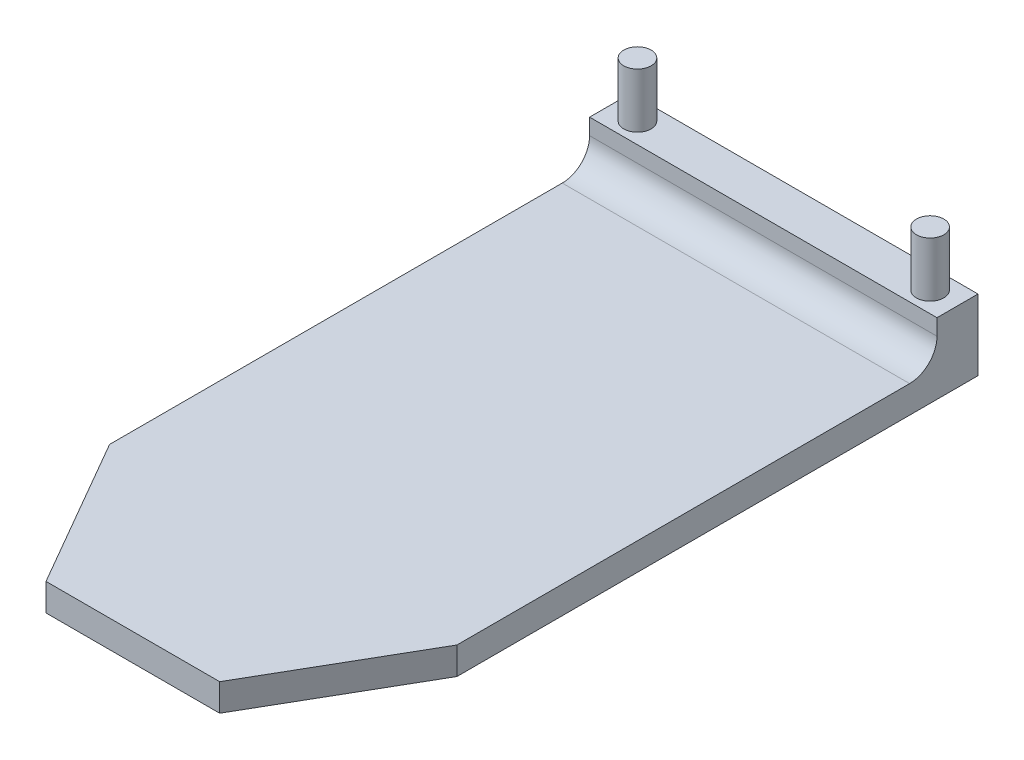
ISO-10303-21;
HEADER;
FILE_DESCRIPTION(('STEP AP214'),'2;1');
FILE_NAME('part.step','',(''),(''),'','','');
FILE_SCHEMA(('AUTOMOTIVE_DESIGN { 1 0 10303 214 1 1 1 1 }'));
ENDSEC;
DATA;
#1=APPLICATION_CONTEXT('core data for automotive mechanical design processes');
#2=APPLICATION_PROTOCOL_DEFINITION('international standard','automotive_design',2000,#1);
#3=PRODUCT_CONTEXT('',#1,'mechanical');
#4=PRODUCT('Part','Part','',(#3));
#5=PRODUCT_RELATED_PRODUCT_CATEGORY('part','',(#4));
#6=PRODUCT_DEFINITION_FORMATION('','',#4);
#7=PRODUCT_DEFINITION_CONTEXT('part definition',#1,'design');
#8=PRODUCT_DEFINITION('design','',#6,#7);
#9=PRODUCT_DEFINITION_SHAPE('','',#8);
#10=(LENGTH_UNIT() NAMED_UNIT(*) SI_UNIT(.MILLI.,.METRE.));
#11=(NAMED_UNIT(*) PLANE_ANGLE_UNIT() SI_UNIT($,.RADIAN.));
#12=(NAMED_UNIT(*) SI_UNIT($,.STERADIAN.) SOLID_ANGLE_UNIT());
#13=UNCERTAINTY_MEASURE_WITH_UNIT(LENGTH_MEASURE(1.E-05),#10,'distance_accuracy_value','');
#14=(GEOMETRIC_REPRESENTATION_CONTEXT(3) GLOBAL_UNCERTAINTY_ASSIGNED_CONTEXT((#13)) GLOBAL_UNIT_ASSIGNED_CONTEXT((#10,
#11,#12)) REPRESENTATION_CONTEXT('',''));
#15=CARTESIAN_POINT('',(0.,0.,0.));
#16=DIRECTION('',(0.,0.,1.));
#17=DIRECTION('',(1.,0.,0.));
#18=AXIS2_PLACEMENT_3D('',#15,#16,#17);
#19=CARTESIAN_POINT('',(0.,-12.7,0.));
#20=DIRECTION('',(0.,-1.,0.));
#21=DIRECTION('',(0.,0.,-1.));
#22=AXIS2_PLACEMENT_3D('',#19,#20,#21);
#23=PLANE('',#22);
#24=DIRECTION('',(0.,0.,1.));
#25=VECTOR('',#24,1.);
#26=CARTESIAN_POINT('',(52.7,-12.7,0.));
#27=LINE('',#26,#25);
#28=CARTESIAN_POINT('',(52.7,-12.7,-105.95));
#29=VERTEX_POINT('',#28);
#30=CARTESIAN_POINT('',(52.7,-12.7,-72.85));
#31=VERTEX_POINT('',#30);
#32=EDGE_CURVE('E132',#29,#31,#27,.T.);
#33=ORIENTED_EDGE('',*,*,#32,.F.);
#34=DIRECTION('',(1.,0.,0.));
#35=VECTOR('',#34,1.);
#36=CARTESIAN_POINT('',(27.3,-12.7,-105.95));
#37=LINE('',#36,#35);
#38=CARTESIAN_POINT('',(27.3,-12.7,-105.95));
#39=VERTEX_POINT('',#38);
#40=EDGE_CURVE('E60',#29,#39,#37,.F.);
#41=ORIENTED_EDGE('',*,*,#40,.T.);
#42=DIRECTION('',(0.,0.,1.));
#43=VECTOR('',#42,1.);
#44=CARTESIAN_POINT('',(27.3,-12.7,0.));
#45=LINE('',#44,#43);
#46=CARTESIAN_POINT('',(27.3,-12.7,-72.85));
#47=VERTEX_POINT('',#46);
#48=EDGE_CURVE('E143',#39,#47,#45,.T.);
#49=ORIENTED_EDGE('',*,*,#48,.T.);
#50=DIRECTION('',(-0.5,0.,-0.866025403784439));
#51=VECTOR('',#50,1.);
#52=CARTESIAN_POINT('',(52.0199753328482,-12.7,-30.0337467616576));
#53=LINE('',#52,#51);
#54=CARTESIAN_POINT('',(33.65,-12.7,-61.8514773719376));
#55=VERTEX_POINT('',#54);
#56=EDGE_CURVE('E159',#55,#47,#53,.T.);
#57=ORIENTED_EDGE('',*,*,#56,.F.);
#58=DIRECTION('',(-1.,0.,0.));
#59=VECTOR('',#58,1.);
#60=CARTESIAN_POINT('',(0.,-12.7,-61.8514773719376));
#61=LINE('',#60,#59);
#62=CARTESIAN_POINT('',(46.35,-12.7,-61.8514773719376));
#63=VERTEX_POINT('',#62);
#64=EDGE_CURVE('E157',#63,#55,#61,.T.);
#65=ORIENTED_EDGE('',*,*,#64,.F.);
#66=DIRECTION('',(-0.5,0.,0.866025403784439));
#67=VECTOR('',#66,1.);
#68=CARTESIAN_POINT('',(7.98002466715183,-12.7,4.60726938971996));
#69=LINE('',#68,#67);
#70=EDGE_CURVE('E134',#31,#63,#69,.T.);
#71=ORIENTED_EDGE('',*,*,#70,.F.);
#72=EDGE_LOOP('',(#33,#41,#49,#57,#65,#71));
#73=FACE_BOUND('',#72,.T.);
#74=ADVANCED_FACE('F39',(#73),#23,.F.);
#75=CARTESIAN_POINT('',(52.7,-14.7,0.));
#76=DIRECTION('',(-1.,0.,0.));
#77=DIRECTION('',(0.,0.,1.));
#78=AXIS2_PLACEMENT_3D('',#75,#76,#77);
#79=PLANE('',#78);
#80=DIRECTION('',(0.,1.,0.));
#81=VECTOR('',#80,1.);
#82=CARTESIAN_POINT('',(52.7,-14.7,-110.95));
#83=LINE('',#82,#81);
#84=CARTESIAN_POINT('',(52.7,-14.7,-110.95));
#85=VERTEX_POINT('',#84);
#86=CARTESIAN_POINT('',(52.7,-9.525,-110.95));
#87=VERTEX_POINT('',#86);
#88=EDGE_CURVE('E154',#85,#87,#83,.T.);
#89=ORIENTED_EDGE('',*,*,#88,.T.);
#90=DIRECTION('',(0.,0.,-1.));
#91=VECTOR('',#90,1.);
#92=CARTESIAN_POINT('',(52.7,-9.525,-110.95));
#93=LINE('',#92,#91);
#94=CARTESIAN_POINT('',(52.7,-9.525,-107.95));
#95=VERTEX_POINT('',#94);
#96=EDGE_CURVE('E119',#95,#87,#93,.T.);
#97=ORIENTED_EDGE('',*,*,#96,.F.);
#98=DIRECTION('',(0.,-1.,0.));
#99=VECTOR('',#98,1.);
#100=CARTESIAN_POINT('',(52.7,-9.525,-107.95));
#101=LINE('',#100,#99);
#102=CARTESIAN_POINT('',(52.7,-10.7,-107.95));
#103=VERTEX_POINT('',#102);
#104=EDGE_CURVE('E115',#95,#103,#101,.T.);
#105=ORIENTED_EDGE('',*,*,#104,.T.);
#106=CARTESIAN_POINT('',(52.7,-10.7,-105.95));
#107=DIRECTION('',(-1.,0.,0.));
#108=DIRECTION('',(0.,0.,1.));
#109=AXIS2_PLACEMENT_3D('',#106,#107,#108);
#110=CIRCLE('',#109,2.);
#111=EDGE_CURVE('E47',#103,#29,#110,.T.);
#112=ORIENTED_EDGE('',*,*,#111,.T.);
#113=ORIENTED_EDGE('',*,*,#32,.T.);
#114=DIRECTION('',(0.,1.,0.));
#115=VECTOR('',#114,1.);
#116=CARTESIAN_POINT('',(52.7,-14.7,-72.85));
#117=LINE('',#116,#115);
#118=CARTESIAN_POINT('',(52.7,-14.7,-72.85));
#119=VERTEX_POINT('',#118);
#120=EDGE_CURVE('E175',#119,#31,#117,.T.);
#121=ORIENTED_EDGE('',*,*,#120,.F.);
#122=DIRECTION('',(0.,0.,1.));
#123=VECTOR('',#122,1.);
#124=CARTESIAN_POINT('',(52.7,-14.7,0.));
#125=LINE('',#124,#123);
#126=EDGE_CURVE('E139',#85,#119,#125,.T.);
#127=ORIENTED_EDGE('',*,*,#126,.F.);
#128=EDGE_LOOP('',(#89,#97,#105,#112,#113,#121,#127));
#129=FACE_BOUND('',#128,.T.);
#130=ADVANCED_FACE('F181',(#129),#79,.F.);
#131=CARTESIAN_POINT('',(7.98002466715183,-14.7,4.60726938971996));
#132=DIRECTION('',(-0.866025403784439,0.,-0.5));
#133=DIRECTION('',(-0.5,0.,0.866025403784439));
#134=AXIS2_PLACEMENT_3D('',#131,#132,#133);
#135=PLANE('',#134);
#136=ORIENTED_EDGE('',*,*,#70,.T.);
#137=DIRECTION('',(0.,1.,0.));
#138=VECTOR('',#137,1.);
#139=CARTESIAN_POINT('',(46.35,-14.7,-61.8514773719376));
#140=LINE('',#139,#138);
#141=CARTESIAN_POINT('',(46.35,-14.7,-61.8514773719376));
#142=VERTEX_POINT('',#141);
#143=EDGE_CURVE('E172',#142,#63,#140,.T.);
#144=ORIENTED_EDGE('',*,*,#143,.F.);
#145=DIRECTION('',(-0.5,0.,0.866025403784439));
#146=VECTOR('',#145,1.);
#147=CARTESIAN_POINT('',(7.98002466715183,-14.7,4.60726938971996));
#148=LINE('',#147,#146);
#149=EDGE_CURVE('E142',#119,#142,#148,.T.);
#150=ORIENTED_EDGE('',*,*,#149,.F.);
#151=ORIENTED_EDGE('',*,*,#120,.T.);
#152=EDGE_LOOP('',(#136,#144,#150,#151));
#153=FACE_BOUND('',#152,.T.);
#154=ADVANCED_FACE('F227',(#153),#135,.F.);
#155=CARTESIAN_POINT('',(0.,-14.7,-61.8514773719376));
#156=DIRECTION('',(0.,0.,-1.));
#157=DIRECTION('',(-1.,0.,0.));
#158=AXIS2_PLACEMENT_3D('',#155,#156,#157);
#159=PLANE('',#158);
#160=ORIENTED_EDGE('',*,*,#64,.T.);
#161=DIRECTION('',(0.,1.,0.));
#162=VECTOR('',#161,1.);
#163=CARTESIAN_POINT('',(33.65,-14.7,-61.8514773719376));
#164=LINE('',#163,#162);
#165=CARTESIAN_POINT('',(33.65,-14.7,-61.8514773719376));
#166=VERTEX_POINT('',#165);
#167=EDGE_CURVE('E169',#166,#55,#164,.T.);
#168=ORIENTED_EDGE('',*,*,#167,.F.);
#169=DIRECTION('',(-1.,0.,0.));
#170=VECTOR('',#169,1.);
#171=CARTESIAN_POINT('',(0.,-14.7,-61.8514773719376));
#172=LINE('',#171,#170);
#173=EDGE_CURVE('E145',#142,#166,#172,.T.);
#174=ORIENTED_EDGE('',*,*,#173,.F.);
#175=ORIENTED_EDGE('',*,*,#143,.T.);
#176=EDGE_LOOP('',(#160,#168,#174,#175));
#177=FACE_BOUND('',#176,.T.);
#178=ADVANCED_FACE('F241',(#177),#159,.F.);
#179=CARTESIAN_POINT('',(52.0199753328482,-14.7,-30.0337467616576));
#180=DIRECTION('',(0.866025403784439,0.,-0.5));
#181=DIRECTION('',(-0.5,0.,-0.866025403784439));
#182=AXIS2_PLACEMENT_3D('',#179,#180,#181);
#183=PLANE('',#182);
#184=ORIENTED_EDGE('',*,*,#56,.T.);
#185=DIRECTION('',(0.,1.,0.));
#186=VECTOR('',#185,1.);
#187=CARTESIAN_POINT('',(27.3,-14.7,-72.85));
#188=LINE('',#187,#186);
#189=CARTESIAN_POINT('',(27.3,-14.7,-72.85));
#190=VERTEX_POINT('',#189);
#191=EDGE_CURVE('E166',#190,#47,#188,.T.);
#192=ORIENTED_EDGE('',*,*,#191,.F.);
#193=DIRECTION('',(-0.5,0.,-0.866025403784439));
#194=VECTOR('',#193,1.);
#195=CARTESIAN_POINT('',(52.0199753328482,-14.7,-30.0337467616576));
#196=LINE('',#195,#194);
#197=EDGE_CURVE('E147',#166,#190,#196,.T.);
#198=ORIENTED_EDGE('',*,*,#197,.F.);
#199=ORIENTED_EDGE('',*,*,#167,.T.);
#200=EDGE_LOOP('',(#184,#192,#198,#199));
#201=FACE_BOUND('',#200,.T.);
#202=ADVANCED_FACE('F238',(#201),#183,.F.);
#203=CARTESIAN_POINT('',(27.3,-14.7,0.));
#204=DIRECTION('',(-1.,0.,0.));
#205=DIRECTION('',(0.,0.,1.));
#206=AXIS2_PLACEMENT_3D('',#203,#204,#205);
#207=PLANE('',#206);
#208=ORIENTED_EDGE('',*,*,#48,.F.);
#209=CARTESIAN_POINT('',(27.3,-10.7,-105.95));
#210=DIRECTION('',(-1.,0.,0.));
#211=DIRECTION('',(0.,0.,1.));
#212=AXIS2_PLACEMENT_3D('',#209,#210,#211);
#213=CIRCLE('',#212,2.);
#214=CARTESIAN_POINT('',(27.3,-10.7,-107.95));
#215=VERTEX_POINT('',#214);
#216=EDGE_CURVE('E11',#39,#215,#213,.F.);
#217=ORIENTED_EDGE('',*,*,#216,.T.);
#218=DIRECTION('',(0.,-1.,0.));
#219=VECTOR('',#218,1.);
#220=CARTESIAN_POINT('',(27.3,-9.525,-107.95));
#221=LINE('',#220,#219);
#222=CARTESIAN_POINT('',(27.3,-9.525,-107.95));
#223=VERTEX_POINT('',#222);
#224=EDGE_CURVE('E113',#223,#215,#221,.T.);
#225=ORIENTED_EDGE('',*,*,#224,.F.);
#226=DIRECTION('',(0.,0.,1.));
#227=VECTOR('',#226,1.);
#228=CARTESIAN_POINT('',(27.3,-9.525,-110.95));
#229=LINE('',#228,#227);
#230=CARTESIAN_POINT('',(27.3,-9.525,-110.95));
#231=VERTEX_POINT('',#230);
#232=EDGE_CURVE('E120',#231,#223,#229,.T.);
#233=ORIENTED_EDGE('',*,*,#232,.F.);
#234=DIRECTION('',(0.,1.,0.));
#235=VECTOR('',#234,1.);
#236=CARTESIAN_POINT('',(27.3,-14.7,-110.95));
#237=LINE('',#236,#235);
#238=CARTESIAN_POINT('',(27.3,-14.7,-110.95));
#239=VERTEX_POINT('',#238);
#240=EDGE_CURVE('E164',#239,#231,#237,.T.);
#241=ORIENTED_EDGE('',*,*,#240,.F.);
#242=DIRECTION('',(0.,0.,1.));
#243=VECTOR('',#242,1.);
#244=CARTESIAN_POINT('',(27.3,-14.7,0.));
#245=LINE('',#244,#243);
#246=EDGE_CURVE('E149',#239,#190,#245,.T.);
#247=ORIENTED_EDGE('',*,*,#246,.T.);
#248=ORIENTED_EDGE('',*,*,#191,.T.);
#249=EDGE_LOOP('',(#208,#217,#225,#233,#241,#247,#248));
#250=FACE_BOUND('',#249,.T.);
#251=ADVANCED_FACE('F130',(#250),#207,.T.);
#252=CARTESIAN_POINT('',(0.,-14.7,-110.95));
#253=DIRECTION('',(0.,0.,-1.));
#254=DIRECTION('',(-1.,0.,0.));
#255=AXIS2_PLACEMENT_3D('',#252,#253,#254);
#256=PLANE('',#255);
#257=ORIENTED_EDGE('',*,*,#240,.T.);
#258=DIRECTION('',(-1.,0.,0.));
#259=VECTOR('',#258,1.);
#260=CARTESIAN_POINT('',(27.3,-9.525,-110.95));
#261=LINE('',#260,#259);
#262=EDGE_CURVE('E126',#87,#231,#261,.T.);
#263=ORIENTED_EDGE('',*,*,#262,.F.);
#264=ORIENTED_EDGE('',*,*,#88,.F.);
#265=DIRECTION('',(-1.,0.,0.));
#266=VECTOR('',#265,1.);
#267=CARTESIAN_POINT('',(0.,-14.7,-110.95));
#268=LINE('',#267,#266);
#269=EDGE_CURVE('E152',#85,#239,#268,.T.);
#270=ORIENTED_EDGE('',*,*,#269,.T.);
#271=EDGE_LOOP('',(#257,#263,#264,#270));
#272=FACE_BOUND('',#271,.T.);
#273=ADVANCED_FACE('F232',(#272),#256,.T.);
#274=CARTESIAN_POINT('',(0.,-14.7,0.));
#275=DIRECTION('',(0.,-1.,0.));
#276=DIRECTION('',(0.,0.,-1.));
#277=AXIS2_PLACEMENT_3D('',#274,#275,#276);
#278=PLANE('',#277);
#279=ORIENTED_EDGE('',*,*,#126,.T.);
#280=ORIENTED_EDGE('',*,*,#149,.T.);
#281=ORIENTED_EDGE('',*,*,#173,.T.);
#282=ORIENTED_EDGE('',*,*,#197,.T.);
#283=ORIENTED_EDGE('',*,*,#246,.F.);
#284=ORIENTED_EDGE('',*,*,#269,.F.);
#285=EDGE_LOOP('',(#279,#280,#281,#282,#283,#284));
#286=FACE_BOUND('',#285,.T.);
#287=ADVANCED_FACE('F230',(#286),#278,.T.);
#288=CARTESIAN_POINT('',(27.3,-9.525,-107.95));
#289=DIRECTION('',(0.,0.,-1.));
#290=DIRECTION('',(-1.,0.,0.));
#291=AXIS2_PLACEMENT_3D('',#288,#289,#290);
#292=PLANE('',#291);
#293=ORIENTED_EDGE('',*,*,#224,.T.);
#294=DIRECTION('',(1.,0.,0.));
#295=VECTOR('',#294,1.);
#296=CARTESIAN_POINT('',(52.7,-10.7,-107.95));
#297=LINE('',#296,#295);
#298=EDGE_CURVE('E178',#215,#103,#297,.T.);
#299=ORIENTED_EDGE('',*,*,#298,.T.);
#300=ORIENTED_EDGE('',*,*,#104,.F.);
#301=DIRECTION('',(1.,0.,0.));
#302=VECTOR('',#301,1.);
#303=CARTESIAN_POINT('',(27.3,-9.525,-107.95));
#304=LINE('',#303,#302);
#305=EDGE_CURVE('E108',#223,#95,#304,.T.);
#306=ORIENTED_EDGE('',*,*,#305,.F.);
#307=EDGE_LOOP('',(#293,#299,#300,#306));
#308=FACE_BOUND('',#307,.T.);
#309=ADVANCED_FACE('F110',(#308),#292,.F.);
#310=CARTESIAN_POINT('',(0.,-9.525,0.));
#311=DIRECTION('',(0.,1.,0.));
#312=DIRECTION('',(0.,0.,1.));
#313=AXIS2_PLACEMENT_3D('',#310,#311,#312);
#314=PLANE('',#313);
#315=CARTESIAN_POINT('',(50.7,-9.525,-109.45));
#316=DIRECTION('',(0.,1.,0.));
#317=DIRECTION('',(0.,0.,1.));
#318=AXIS2_PLACEMENT_3D('',#315,#316,#317);
#319=CIRCLE('',#318,0.999999999999998);
#320=CARTESIAN_POINT('',(50.7,-9.525,-108.45));
#321=VERTEX_POINT('',#320);
#322=EDGE_CURVE('E191',#321,#321,#319,.T.);
#323=ORIENTED_EDGE('',*,*,#322,.F.);
#324=EDGE_LOOP('',(#323));
#325=FACE_BOUND('',#324,.T.);
#326=CARTESIAN_POINT('',(29.3,-9.525,-109.45));
#327=DIRECTION('',(0.,1.,0.));
#328=DIRECTION('',(0.,0.,1.));
#329=AXIS2_PLACEMENT_3D('',#326,#327,#328);
#330=CIRCLE('',#329,1.);
#331=CARTESIAN_POINT('',(29.3,-9.525,-108.45));
#332=VERTEX_POINT('',#331);
#333=EDGE_CURVE('E185',#332,#332,#330,.T.);
#334=ORIENTED_EDGE('',*,*,#333,.F.);
#335=EDGE_LOOP('',(#334));
#336=FACE_BOUND('',#335,.T.);
#337=ORIENTED_EDGE('',*,*,#232,.T.);
#338=ORIENTED_EDGE('',*,*,#305,.T.);
#339=ORIENTED_EDGE('',*,*,#96,.T.);
#340=ORIENTED_EDGE('',*,*,#262,.T.);
#341=EDGE_LOOP('',(#337,#338,#339,#340));
#342=FACE_BOUND('',#341,.T.);
#343=ADVANCED_FACE('F124',(#325,#336,#342),#314,.T.);
#344=CARTESIAN_POINT('',(27.3,-10.7,-105.95));
#345=DIRECTION('',(-1.,0.,0.));
#346=DIRECTION('',(0.,0.,1.));
#347=AXIS2_PLACEMENT_3D('',#344,#345,#346);
#348=CYLINDRICAL_SURFACE('',#347,2.);
#349=ORIENTED_EDGE('',*,*,#216,.F.);
#350=ORIENTED_EDGE('',*,*,#40,.F.);
#351=ORIENTED_EDGE('',*,*,#111,.F.);
#352=ORIENTED_EDGE('',*,*,#298,.F.);
#353=EDGE_LOOP('',(#349,#350,#351,#352));
#354=FACE_BOUND('',#353,.T.);
#355=ADVANCED_FACE('F41',(#354),#348,.F.);
#356=CARTESIAN_POINT('',(29.3,-5.525,-109.45));
#357=DIRECTION('',(0.,-1.,0.));
#358=DIRECTION('',(0.,0.,-1.));
#359=AXIS2_PLACEMENT_3D('',#356,#357,#358);
#360=CYLINDRICAL_SURFACE('',#359,1.);
#361=CARTESIAN_POINT('',(29.3,-5.525,-109.45));
#362=DIRECTION('',(0.,1.,0.));
#363=DIRECTION('',(0.,0.,1.));
#364=AXIS2_PLACEMENT_3D('',#361,#362,#363);
#365=CIRCLE('',#364,1.);
#366=CARTESIAN_POINT('',(29.3,-5.525,-108.45));
#367=VERTEX_POINT('',#366);
#368=EDGE_CURVE('E128',#367,#367,#365,.T.);
#369=ORIENTED_EDGE('',*,*,#368,.F.);
#370=EDGE_LOOP('',(#369));
#371=FACE_BOUND('',#370,.T.);
#372=ORIENTED_EDGE('',*,*,#333,.T.);
#373=EDGE_LOOP('',(#372));
#374=FACE_BOUND('',#373,.T.);
#375=ADVANCED_FACE('F211',(#371,#374),#360,.T.);
#376=CARTESIAN_POINT('',(29.3,-5.525,-109.45));
#377=DIRECTION('',(0.,1.,0.));
#378=DIRECTION('',(0.,0.,1.));
#379=AXIS2_PLACEMENT_3D('',#376,#377,#378);
#380=PLANE('',#379);
#381=ORIENTED_EDGE('',*,*,#368,.T.);
#382=EDGE_LOOP('',(#381));
#383=FACE_BOUND('',#382,.T.);
#384=ADVANCED_FACE('F202',(#383),#380,.T.);
#385=CARTESIAN_POINT('',(50.7,-5.525,-109.45));
#386=DIRECTION('',(0.,-1.,0.));
#387=DIRECTION('',(0.,0.,-1.));
#388=AXIS2_PLACEMENT_3D('',#385,#386,#387);
#389=CYLINDRICAL_SURFACE('',#388,0.999999999999998);
#390=CARTESIAN_POINT('',(50.7,-5.525,-109.45));
#391=DIRECTION('',(0.,1.,0.));
#392=DIRECTION('',(0.,0.,1.));
#393=AXIS2_PLACEMENT_3D('',#390,#391,#392);
#394=CIRCLE('',#393,0.999999999999998);
#395=CARTESIAN_POINT('',(50.7,-5.525,-108.45));
#396=VERTEX_POINT('',#395);
#397=EDGE_CURVE('E188',#396,#396,#394,.T.);
#398=ORIENTED_EDGE('',*,*,#397,.F.);
#399=EDGE_LOOP('',(#398));
#400=FACE_BOUND('',#399,.T.);
#401=ORIENTED_EDGE('',*,*,#322,.T.);
#402=EDGE_LOOP('',(#401));
#403=FACE_BOUND('',#402,.T.);
#404=ADVANCED_FACE('F199',(#400,#403),#389,.T.);
#405=CARTESIAN_POINT('',(50.7,-5.525,-109.45));
#406=DIRECTION('',(0.,1.,0.));
#407=DIRECTION('',(0.,0.,1.));
#408=AXIS2_PLACEMENT_3D('',#405,#406,#407);
#409=PLANE('',#408);
#410=ORIENTED_EDGE('',*,*,#397,.T.);
#411=EDGE_LOOP('',(#410));
#412=FACE_BOUND('',#411,.T.);
#413=ADVANCED_FACE('F197',(#412),#409,.T.);
#414=CLOSED_SHELL('',(#74,#130,#154,#178,#202,#251,#273,#287,#309,#343,#355,#375,#384,#404,#413));
#415=MANIFOLD_SOLID_BREP('B2',#414);
#416=ADVANCED_BREP_SHAPE_REPRESENTATION('',(#18,#415),#14);
#417=SHAPE_DEFINITION_REPRESENTATION(#9,#416);
ENDSEC;
END-ISO-10303-21;
